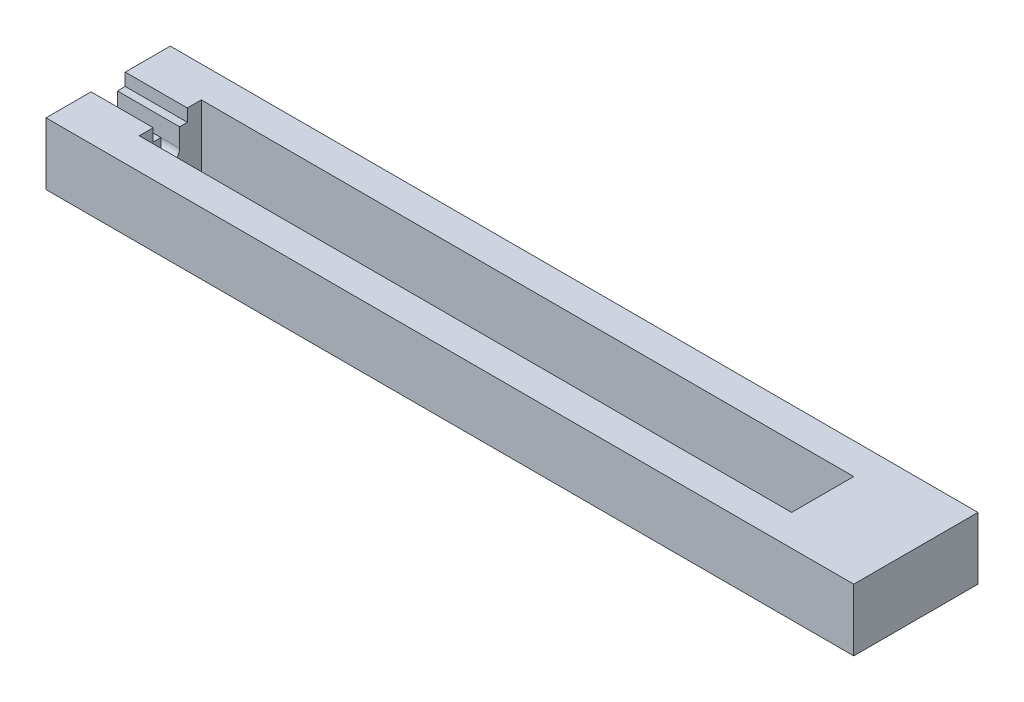
ISO-10303-21;
HEADER;
FILE_DESCRIPTION(('STEP AP214'),'2;1');
FILE_NAME('part.step','',(''),(''),'','','');
FILE_SCHEMA(('AUTOMOTIVE_DESIGN { 1 0 10303 214 1 1 1 1 }'));
ENDSEC;
DATA;
#1=APPLICATION_CONTEXT('core data for automotive mechanical design processes');
#2=APPLICATION_PROTOCOL_DEFINITION('international standard','automotive_design',2000,#1);
#3=PRODUCT_CONTEXT('',#1,'mechanical');
#4=PRODUCT('Part','Part','',(#3));
#5=PRODUCT_RELATED_PRODUCT_CATEGORY('part','',(#4));
#6=PRODUCT_DEFINITION_FORMATION('','',#4);
#7=PRODUCT_DEFINITION_CONTEXT('part definition',#1,'design');
#8=PRODUCT_DEFINITION('design','',#6,#7);
#9=PRODUCT_DEFINITION_SHAPE('','',#8);
#10=(LENGTH_UNIT() NAMED_UNIT(*) SI_UNIT(.MILLI.,.METRE.));
#11=(NAMED_UNIT(*) PLANE_ANGLE_UNIT() SI_UNIT($,.RADIAN.));
#12=(NAMED_UNIT(*) SI_UNIT($,.STERADIAN.) SOLID_ANGLE_UNIT());
#13=UNCERTAINTY_MEASURE_WITH_UNIT(LENGTH_MEASURE(1.E-05),#10,'distance_accuracy_value','');
#14=(GEOMETRIC_REPRESENTATION_CONTEXT(3) GLOBAL_UNCERTAINTY_ASSIGNED_CONTEXT((#13)) GLOBAL_UNIT_ASSIGNED_CONTEXT((#10,
#11,#12)) REPRESENTATION_CONTEXT('',''));
#15=CARTESIAN_POINT('',(0.,0.,0.));
#16=DIRECTION('',(0.,0.,1.));
#17=DIRECTION('',(1.,0.,0.));
#18=AXIS2_PLACEMENT_3D('',#15,#16,#17);
#19=CARTESIAN_POINT('',(0.,1.,0.));
#20=DIRECTION('',(0.,-1.,0.));
#21=DIRECTION('',(0.,0.,-1.));
#22=AXIS2_PLACEMENT_3D('',#19,#20,#21);
#23=PLANE('',#22);
#24=DIRECTION('',(-1.,0.,0.));
#25=VECTOR('',#24,1.);
#26=CARTESIAN_POINT('',(-5.5,1.,-0.275));
#27=LINE('',#26,#25);
#28=CARTESIAN_POINT('',(-5.5,1.,-0.275));
#29=VERTEX_POINT('',#28);
#30=CARTESIAN_POINT('',(-6.5,1.,-0.275));
#31=VERTEX_POINT('',#30);
#32=EDGE_CURVE('E201',#29,#31,#27,.T.);
#33=ORIENTED_EDGE('',*,*,#32,.F.);
#34=DIRECTION('',(0.,0.,1.));
#35=VECTOR('',#34,1.);
#36=CARTESIAN_POINT('',(-5.5,1.,-0.5));
#37=LINE('',#36,#35);
#38=CARTESIAN_POINT('',(-5.5,1.,-0.5));
#39=VERTEX_POINT('',#38);
#40=EDGE_CURVE('E216',#39,#29,#37,.T.);
#41=ORIENTED_EDGE('',*,*,#40,.F.);
#42=DIRECTION('',(-1.,0.,0.));
#43=VECTOR('',#42,1.);
#44=CARTESIAN_POINT('',(-5.5,1.,-0.5));
#45=LINE('',#44,#43);
#46=CARTESIAN_POINT('',(5.,0.999999999999998,-0.5));
#47=VERTEX_POINT('',#46);
#48=EDGE_CURVE('E213',#47,#39,#45,.T.);
#49=ORIENTED_EDGE('',*,*,#48,.F.);
#50=DIRECTION('',(0.,0.,-1.));
#51=VECTOR('',#50,1.);
#52=CARTESIAN_POINT('',(5.,0.999999999999998,-0.5));
#53=LINE('',#52,#51);
#54=CARTESIAN_POINT('',(5.,0.999999999999999,0.5));
#55=VERTEX_POINT('',#54);
#56=EDGE_CURVE('E211',#55,#47,#53,.T.);
#57=ORIENTED_EDGE('',*,*,#56,.F.);
#58=DIRECTION('',(1.,0.,0.));
#59=VECTOR('',#58,1.);
#60=CARTESIAN_POINT('',(-5.5,1.,0.5));
#61=LINE('',#60,#59);
#62=CARTESIAN_POINT('',(-5.5,1.,0.5));
#63=VERTEX_POINT('',#62);
#64=EDGE_CURVE('E218',#63,#55,#61,.T.);
#65=ORIENTED_EDGE('',*,*,#64,.F.);
#66=CARTESIAN_POINT('',(-5.5,1.,0.275));
#67=VERTEX_POINT('',#66);
#68=EDGE_CURVE('E55',#67,#63,#37,.T.);
#69=ORIENTED_EDGE('',*,*,#68,.F.);
#70=DIRECTION('',(-1.,0.,0.));
#71=VECTOR('',#70,1.);
#72=CARTESIAN_POINT('',(-5.5,1.,0.275));
#73=LINE('',#72,#71);
#74=CARTESIAN_POINT('',(-6.5,1.,0.275));
#75=VERTEX_POINT('',#74);
#76=EDGE_CURVE('E203',#67,#75,#73,.T.);
#77=ORIENTED_EDGE('',*,*,#76,.T.);
#78=DIRECTION('',(0.,0.,1.));
#79=VECTOR('',#78,1.);
#80=CARTESIAN_POINT('',(-6.5,1.,1.));
#81=LINE('',#80,#79);
#82=CARTESIAN_POINT('',(-6.5,1.,1.));
#83=VERTEX_POINT('',#82);
#84=EDGE_CURVE('E247',#75,#83,#81,.T.);
#85=ORIENTED_EDGE('',*,*,#84,.T.);
#86=DIRECTION('',(1.,0.,0.));
#87=VECTOR('',#86,1.);
#88=CARTESIAN_POINT('',(-6.5,1.,1.));
#89=LINE('',#88,#87);
#90=CARTESIAN_POINT('',(6.5,0.999999999999998,0.999999999999999));
#91=VERTEX_POINT('',#90);
#92=EDGE_CURVE('E251',#83,#91,#89,.T.);
#93=ORIENTED_EDGE('',*,*,#92,.T.);
#94=DIRECTION('',(0.,0.,-1.));
#95=VECTOR('',#94,1.);
#96=CARTESIAN_POINT('',(6.5,0.999999999999998,0.999999999999999));
#97=LINE('',#96,#95);
#98=CARTESIAN_POINT('',(6.5,0.999999999999998,-1.));
#99=VERTEX_POINT('',#98);
#100=EDGE_CURVE('E241',#91,#99,#97,.T.);
#101=ORIENTED_EDGE('',*,*,#100,.T.);
#102=DIRECTION('',(-1.,0.,0.));
#103=VECTOR('',#102,1.);
#104=CARTESIAN_POINT('',(-6.5,1.,-1.));
#105=LINE('',#104,#103);
#106=CARTESIAN_POINT('',(-6.5,1.,-1.));
#107=VERTEX_POINT('',#106);
#108=EDGE_CURVE('E244',#99,#107,#105,.T.);
#109=ORIENTED_EDGE('',*,*,#108,.T.);
#110=EDGE_CURVE('E248',#107,#31,#81,.T.);
#111=ORIENTED_EDGE('',*,*,#110,.T.);
#112=EDGE_LOOP('',(#33,#41,#49,#57,#65,#69,#77,#85,#93,#101,#109,#111));
#113=FACE_BOUND('',#112,.T.);
#114=ADVANCED_FACE('F32',(#113),#23,.F.);
#115=CARTESIAN_POINT('',(-6.5,1.,1.));
#116=DIRECTION('',(1.,0.,0.));
#117=DIRECTION('',(0.,0.,-1.));
#118=AXIS2_PLACEMENT_3D('',#115,#116,#117);
#119=PLANE('',#118);
#120=DIRECTION('',(0.,1.,0.));
#121=VECTOR('',#120,1.);
#122=CARTESIAN_POINT('',(-6.5,0.,-0.275));
#123=LINE('',#122,#121);
#124=CARTESIAN_POINT('',(-6.5,0.800000000000001,-0.275));
#125=VERTEX_POINT('',#124);
#126=EDGE_CURVE('E171',#125,#31,#123,.T.);
#127=ORIENTED_EDGE('',*,*,#126,.T.);
#128=ORIENTED_EDGE('',*,*,#110,.F.);
#129=DIRECTION('',(0.,-1.,0.));
#130=VECTOR('',#129,1.);
#131=CARTESIAN_POINT('',(-6.5,1.,-1.));
#132=LINE('',#131,#130);
#133=CARTESIAN_POINT('',(-6.5,0.,-1.));
#134=VERTEX_POINT('',#133);
#135=EDGE_CURVE('E40',#107,#134,#132,.T.);
#136=ORIENTED_EDGE('',*,*,#135,.T.);
#137=DIRECTION('',(0.,0.,1.));
#138=VECTOR('',#137,1.);
#139=CARTESIAN_POINT('',(-6.5,0.,1.));
#140=LINE('',#139,#138);
#141=CARTESIAN_POINT('',(-6.5,0.,1.));
#142=VERTEX_POINT('',#141);
#143=EDGE_CURVE('E258',#134,#142,#140,.T.);
#144=ORIENTED_EDGE('',*,*,#143,.T.);
#145=DIRECTION('',(0.,-1.,0.));
#146=VECTOR('',#145,1.);
#147=CARTESIAN_POINT('',(-6.5,1.,1.));
#148=LINE('',#147,#146);
#149=EDGE_CURVE('E263',#83,#142,#148,.T.);
#150=ORIENTED_EDGE('',*,*,#149,.F.);
#151=ORIENTED_EDGE('',*,*,#84,.F.);
#152=DIRECTION('',(0.,1.,0.));
#153=VECTOR('',#152,1.);
#154=CARTESIAN_POINT('',(-6.5,0.,0.275));
#155=LINE('',#154,#153);
#156=CARTESIAN_POINT('',(-6.5,0.800000000000001,0.275));
#157=VERTEX_POINT('',#156);
#158=EDGE_CURVE('E192',#157,#75,#155,.T.);
#159=ORIENTED_EDGE('',*,*,#158,.F.);
#160=DIRECTION('',(0.,0.,1.));
#161=VECTOR('',#160,1.);
#162=CARTESIAN_POINT('',(-6.5,0.800000000000001,0.));
#163=LINE('',#162,#161);
#164=CARTESIAN_POINT('',(-6.5,0.800000000000001,0.15));
#165=VERTEX_POINT('',#164);
#166=EDGE_CURVE('E189',#165,#157,#163,.T.);
#167=ORIENTED_EDGE('',*,*,#166,.F.);
#168=DIRECTION('',(0.,1.,0.));
#169=VECTOR('',#168,1.);
#170=CARTESIAN_POINT('',(-6.5,0.,0.15));
#171=LINE('',#170,#169);
#172=CARTESIAN_POINT('',(-6.5,0.500000000000001,0.15));
#173=VERTEX_POINT('',#172);
#174=EDGE_CURVE('E186',#173,#165,#171,.T.);
#175=ORIENTED_EDGE('',*,*,#174,.F.);
#176=CARTESIAN_POINT('',(-6.5,0.500000000000001,0.));
#177=DIRECTION('',(-1.,0.,0.));
#178=DIRECTION('',(0.,0.,1.));
#179=AXIS2_PLACEMENT_3D('',#176,#177,#178);
#180=CIRCLE('',#179,0.15);
#181=CARTESIAN_POINT('',(-6.5,0.500000000000002,-0.15));
#182=VERTEX_POINT('',#181);
#183=EDGE_CURVE('E184',#182,#173,#180,.T.);
#184=ORIENTED_EDGE('',*,*,#183,.F.);
#185=DIRECTION('',(0.,1.,0.));
#186=VECTOR('',#185,1.);
#187=CARTESIAN_POINT('',(-6.5,0.,-0.15));
#188=LINE('',#187,#186);
#189=CARTESIAN_POINT('',(-6.5,0.800000000000001,-0.15));
#190=VERTEX_POINT('',#189);
#191=EDGE_CURVE('E152',#182,#190,#188,.T.);
#192=ORIENTED_EDGE('',*,*,#191,.T.);
#193=DIRECTION('',(0.,0.,1.));
#194=VECTOR('',#193,1.);
#195=CARTESIAN_POINT('',(-6.5,0.800000000000001,0.));
#196=LINE('',#195,#194);
#197=EDGE_CURVE('E168',#125,#190,#196,.T.);
#198=ORIENTED_EDGE('',*,*,#197,.F.);
#199=EDGE_LOOP('',(#127,#128,#136,#144,#150,#151,#159,#167,#175,#184,#192,#198));
#200=FACE_BOUND('',#199,.T.);
#201=ADVANCED_FACE('F270',(#200),#119,.F.);
#202=CARTESIAN_POINT('',(-5.5,1.,-0.5));
#203=DIRECTION('',(1.,0.,0.));
#204=DIRECTION('',(0.,0.,-1.));
#205=AXIS2_PLACEMENT_3D('',#202,#203,#204);
#206=PLANE('',#205);
#207=ORIENTED_EDGE('',*,*,#40,.T.);
#208=DIRECTION('',(0.,1.,0.));
#209=VECTOR('',#208,1.);
#210=CARTESIAN_POINT('',(-5.5,0.,-0.275));
#211=LINE('',#210,#209);
#212=CARTESIAN_POINT('',(-5.5,0.800000000000001,-0.275));
#213=VERTEX_POINT('',#212);
#214=EDGE_CURVE('E180',#213,#29,#211,.T.);
#215=ORIENTED_EDGE('',*,*,#214,.F.);
#216=DIRECTION('',(0.,0.,1.));
#217=VECTOR('',#216,1.);
#218=CARTESIAN_POINT('',(-5.5,0.800000000000001,0.));
#219=LINE('',#218,#217);
#220=CARTESIAN_POINT('',(-5.5,0.800000000000001,-0.15));
#221=VERTEX_POINT('',#220);
#222=EDGE_CURVE('E157',#213,#221,#219,.T.);
#223=ORIENTED_EDGE('',*,*,#222,.T.);
#224=DIRECTION('',(0.,1.,0.));
#225=VECTOR('',#224,1.);
#226=CARTESIAN_POINT('',(-5.5,0.,-0.15));
#227=LINE('',#226,#225);
#228=CARTESIAN_POINT('',(-5.5,0.500000000000001,-0.15));
#229=VERTEX_POINT('',#228);
#230=EDGE_CURVE('E149',#229,#221,#227,.T.);
#231=ORIENTED_EDGE('',*,*,#230,.F.);
#232=CARTESIAN_POINT('',(-5.5,0.500000000000001,0.));
#233=DIRECTION('',(-1.,0.,0.));
#234=DIRECTION('',(0.,0.,1.));
#235=AXIS2_PLACEMENT_3D('',#232,#233,#234);
#236=CIRCLE('',#235,0.15);
#237=CARTESIAN_POINT('',(-5.5,0.500000000000001,0.15));
#238=VERTEX_POINT('',#237);
#239=EDGE_CURVE('E160',#229,#238,#236,.T.);
#240=ORIENTED_EDGE('',*,*,#239,.T.);
#241=DIRECTION('',(0.,1.,0.));
#242=VECTOR('',#241,1.);
#243=CARTESIAN_POINT('',(-5.5,0.,0.15));
#244=LINE('',#243,#242);
#245=CARTESIAN_POINT('',(-5.5,0.800000000000001,0.15));
#246=VERTEX_POINT('',#245);
#247=EDGE_CURVE('E47',#238,#246,#244,.T.);
#248=ORIENTED_EDGE('',*,*,#247,.T.);
#249=DIRECTION('',(0.,0.,1.));
#250=VECTOR('',#249,1.);
#251=CARTESIAN_POINT('',(-5.5,0.800000000000001,0.));
#252=LINE('',#251,#250);
#253=CARTESIAN_POINT('',(-5.5,0.800000000000001,0.275));
#254=VERTEX_POINT('',#253);
#255=EDGE_CURVE('E175',#246,#254,#252,.T.);
#256=ORIENTED_EDGE('',*,*,#255,.T.);
#257=DIRECTION('',(0.,1.,0.));
#258=VECTOR('',#257,1.);
#259=CARTESIAN_POINT('',(-5.5,0.,0.275));
#260=LINE('',#259,#258);
#261=EDGE_CURVE('E178',#254,#67,#260,.T.);
#262=ORIENTED_EDGE('',*,*,#261,.T.);
#263=ORIENTED_EDGE('',*,*,#68,.T.);
#264=DIRECTION('',(0.,-1.,0.));
#265=VECTOR('',#264,1.);
#266=CARTESIAN_POINT('',(-5.5,1.,0.5));
#267=LINE('',#266,#265);
#268=CARTESIAN_POINT('',(-5.5,0.,0.5));
#269=VERTEX_POINT('',#268);
#270=EDGE_CURVE('E233',#63,#269,#267,.T.);
#271=ORIENTED_EDGE('',*,*,#270,.T.);
#272=DIRECTION('',(0.,0.,1.));
#273=VECTOR('',#272,1.);
#274=CARTESIAN_POINT('',(-5.5,0.,-0.5));
#275=LINE('',#274,#273);
#276=CARTESIAN_POINT('',(-5.5,0.,-0.5));
#277=VERTEX_POINT('',#276);
#278=EDGE_CURVE('E226',#277,#269,#275,.T.);
#279=ORIENTED_EDGE('',*,*,#278,.F.);
#280=DIRECTION('',(0.,-1.,0.));
#281=VECTOR('',#280,1.);
#282=CARTESIAN_POINT('',(-5.5,1.,-0.5));
#283=LINE('',#282,#281);
#284=EDGE_CURVE('E235',#39,#277,#283,.T.);
#285=ORIENTED_EDGE('',*,*,#284,.F.);
#286=EDGE_LOOP('',(#207,#215,#223,#231,#240,#248,#256,#262,#263,#271,#279,#285));
#287=FACE_BOUND('',#286,.T.);
#288=ADVANCED_FACE('F165',(#287),#206,.T.);
#289=CARTESIAN_POINT('',(0.,0.,0.));
#290=DIRECTION('',(0.,-1.,0.));
#291=DIRECTION('',(0.,0.,-1.));
#292=AXIS2_PLACEMENT_3D('',#289,#290,#291);
#293=PLANE('',#292);
#294=DIRECTION('',(0.,0.,-1.));
#295=VECTOR('',#294,1.);
#296=CARTESIAN_POINT('',(6.5,0.,0.999999999999999));
#297=LINE('',#296,#295);
#298=CARTESIAN_POINT('',(6.5,0.,0.999999999999999));
#299=VERTEX_POINT('',#298);
#300=CARTESIAN_POINT('',(6.5,0.,-1.));
#301=VERTEX_POINT('',#300);
#302=EDGE_CURVE('E240',#299,#301,#297,.T.);
#303=ORIENTED_EDGE('',*,*,#302,.F.);
#304=DIRECTION('',(1.,0.,0.));
#305=VECTOR('',#304,1.);
#306=CARTESIAN_POINT('',(-6.5,0.,1.));
#307=LINE('',#306,#305);
#308=EDGE_CURVE('E245',#142,#299,#307,.T.);
#309=ORIENTED_EDGE('',*,*,#308,.F.);
#310=ORIENTED_EDGE('',*,*,#143,.F.);
#311=DIRECTION('',(-1.,0.,0.));
#312=VECTOR('',#311,1.);
#313=CARTESIAN_POINT('',(-6.5,0.,-1.));
#314=LINE('',#313,#312);
#315=EDGE_CURVE('E256',#301,#134,#314,.T.);
#316=ORIENTED_EDGE('',*,*,#315,.F.);
#317=EDGE_LOOP('',(#303,#309,#310,#316));
#318=FACE_BOUND('',#317,.T.);
#319=DIRECTION('',(1.,0.,0.));
#320=VECTOR('',#319,1.);
#321=CARTESIAN_POINT('',(-5.5,0.,0.5));
#322=LINE('',#321,#320);
#323=CARTESIAN_POINT('',(5.,0.,0.5));
#324=VERTEX_POINT('',#323);
#325=EDGE_CURVE('E214',#269,#324,#322,.T.);
#326=ORIENTED_EDGE('',*,*,#325,.T.);
#327=DIRECTION('',(0.,0.,-1.));
#328=VECTOR('',#327,1.);
#329=CARTESIAN_POINT('',(5.,0.,-0.5));
#330=LINE('',#329,#328);
#331=CARTESIAN_POINT('',(5.,0.,-0.5));
#332=VERTEX_POINT('',#331);
#333=EDGE_CURVE('E198',#324,#332,#330,.T.);
#334=ORIENTED_EDGE('',*,*,#333,.T.);
#335=DIRECTION('',(-1.,0.,0.));
#336=VECTOR('',#335,1.);
#337=CARTESIAN_POINT('',(-5.5,0.,-0.5));
#338=LINE('',#337,#336);
#339=EDGE_CURVE('E223',#332,#277,#338,.T.);
#340=ORIENTED_EDGE('',*,*,#339,.T.);
#341=ORIENTED_EDGE('',*,*,#278,.T.);
#342=EDGE_LOOP('',(#326,#334,#340,#341));
#343=FACE_BOUND('',#342,.T.);
#344=ADVANCED_FACE('F276',(#318,#343),#293,.T.);
#345=CARTESIAN_POINT('',(6.5,0.999999999999998,0.999999999999999));
#346=DIRECTION('',(-1.,0.,0.));
#347=DIRECTION('',(0.,0.,1.));
#348=AXIS2_PLACEMENT_3D('',#345,#346,#347);
#349=PLANE('',#348);
#350=ORIENTED_EDGE('',*,*,#302,.T.);
#351=DIRECTION('',(0.,-1.,0.));
#352=VECTOR('',#351,1.);
#353=CARTESIAN_POINT('',(6.5,0.999999999999998,-1.));
#354=LINE('',#353,#352);
#355=EDGE_CURVE('E11',#99,#301,#354,.T.);
#356=ORIENTED_EDGE('',*,*,#355,.F.);
#357=ORIENTED_EDGE('',*,*,#100,.F.);
#358=DIRECTION('',(0.,-1.,0.));
#359=VECTOR('',#358,1.);
#360=CARTESIAN_POINT('',(6.5,0.999999999999998,0.999999999999999));
#361=LINE('',#360,#359);
#362=EDGE_CURVE('E253',#91,#299,#361,.T.);
#363=ORIENTED_EDGE('',*,*,#362,.T.);
#364=EDGE_LOOP('',(#350,#356,#357,#363));
#365=FACE_BOUND('',#364,.T.);
#366=ADVANCED_FACE('F34',(#365),#349,.F.);
#367=CARTESIAN_POINT('',(-6.5,1.,-1.));
#368=DIRECTION('',(0.,0.,1.));
#369=DIRECTION('',(1.,0.,0.));
#370=AXIS2_PLACEMENT_3D('',#367,#368,#369);
#371=PLANE('',#370);
#372=ORIENTED_EDGE('',*,*,#315,.T.);
#373=ORIENTED_EDGE('',*,*,#135,.F.);
#374=ORIENTED_EDGE('',*,*,#108,.F.);
#375=ORIENTED_EDGE('',*,*,#355,.T.);
#376=EDGE_LOOP('',(#372,#373,#374,#375));
#377=FACE_BOUND('',#376,.T.);
#378=ADVANCED_FACE('F325',(#377),#371,.F.);
#379=CARTESIAN_POINT('',(-6.5,1.,1.));
#380=DIRECTION('',(0.,0.,-1.));
#381=DIRECTION('',(-1.,0.,0.));
#382=AXIS2_PLACEMENT_3D('',#379,#380,#381);
#383=PLANE('',#382);
#384=ORIENTED_EDGE('',*,*,#308,.T.);
#385=ORIENTED_EDGE('',*,*,#362,.F.);
#386=ORIENTED_EDGE('',*,*,#92,.F.);
#387=ORIENTED_EDGE('',*,*,#149,.T.);
#388=EDGE_LOOP('',(#384,#385,#386,#387));
#389=FACE_BOUND('',#388,.T.);
#390=ADVANCED_FACE('F280',(#389),#383,.F.);
#391=CARTESIAN_POINT('',(5.,0.999999999999998,-0.5));
#392=DIRECTION('',(-1.,0.,0.));
#393=DIRECTION('',(0.,0.,1.));
#394=AXIS2_PLACEMENT_3D('',#391,#392,#393);
#395=PLANE('',#394);
#396=ORIENTED_EDGE('',*,*,#333,.F.);
#397=DIRECTION('',(0.,-1.,0.));
#398=VECTOR('',#397,1.);
#399=CARTESIAN_POINT('',(5.,0.999999999999999,0.5));
#400=LINE('',#399,#398);
#401=EDGE_CURVE('E220',#55,#324,#400,.T.);
#402=ORIENTED_EDGE('',*,*,#401,.F.);
#403=ORIENTED_EDGE('',*,*,#56,.T.);
#404=DIRECTION('',(0.,-1.,0.));
#405=VECTOR('',#404,1.);
#406=CARTESIAN_POINT('',(5.,0.999999999999998,-0.5));
#407=LINE('',#406,#405);
#408=EDGE_CURVE('E237',#47,#332,#407,.T.);
#409=ORIENTED_EDGE('',*,*,#408,.T.);
#410=EDGE_LOOP('',(#396,#402,#403,#409));
#411=FACE_BOUND('',#410,.T.);
#412=ADVANCED_FACE('F315',(#411),#395,.T.);
#413=CARTESIAN_POINT('',(-5.5,1.,-0.5));
#414=DIRECTION('',(0.,0.,1.));
#415=DIRECTION('',(1.,0.,0.));
#416=AXIS2_PLACEMENT_3D('',#413,#414,#415);
#417=PLANE('',#416);
#418=ORIENTED_EDGE('',*,*,#339,.F.);
#419=ORIENTED_EDGE('',*,*,#408,.F.);
#420=ORIENTED_EDGE('',*,*,#48,.T.);
#421=ORIENTED_EDGE('',*,*,#284,.T.);
#422=EDGE_LOOP('',(#418,#419,#420,#421));
#423=FACE_BOUND('',#422,.T.);
#424=ADVANCED_FACE('F309',(#423),#417,.T.);
#425=CARTESIAN_POINT('',(-5.5,1.,0.5));
#426=DIRECTION('',(0.,0.,-1.));
#427=DIRECTION('',(-1.,0.,0.));
#428=AXIS2_PLACEMENT_3D('',#425,#426,#427);
#429=PLANE('',#428);
#430=ORIENTED_EDGE('',*,*,#325,.F.);
#431=ORIENTED_EDGE('',*,*,#270,.F.);
#432=ORIENTED_EDGE('',*,*,#64,.T.);
#433=ORIENTED_EDGE('',*,*,#401,.T.);
#434=EDGE_LOOP('',(#430,#431,#432,#433));
#435=FACE_BOUND('',#434,.T.);
#436=ADVANCED_FACE('F318',(#435),#429,.T.);
#437=CARTESIAN_POINT('',(-5.5,0.,-0.15));
#438=DIRECTION('',(0.,0.,1.));
#439=DIRECTION('',(1.,0.,0.));
#440=AXIS2_PLACEMENT_3D('',#437,#438,#439);
#441=PLANE('',#440);
#442=ORIENTED_EDGE('',*,*,#191,.F.);
#443=DIRECTION('',(-1.,0.,0.));
#444=VECTOR('',#443,1.);
#445=CARTESIAN_POINT('',(-5.5,0.500000000000001,-0.15));
#446=LINE('',#445,#444);
#447=EDGE_CURVE('E145',#229,#182,#446,.T.);
#448=ORIENTED_EDGE('',*,*,#447,.F.);
#449=ORIENTED_EDGE('',*,*,#230,.T.);
#450=DIRECTION('',(-1.,0.,0.));
#451=VECTOR('',#450,1.);
#452=CARTESIAN_POINT('',(-5.5,0.800000000000001,-0.15));
#453=LINE('',#452,#451);
#454=EDGE_CURVE('E196',#221,#190,#453,.T.);
#455=ORIENTED_EDGE('',*,*,#454,.T.);
#456=EDGE_LOOP('',(#442,#448,#449,#455));
#457=FACE_BOUND('',#456,.T.);
#458=ADVANCED_FACE('F147',(#457),#441,.T.);
#459=CARTESIAN_POINT('',(-5.5,0.800000000000001,0.));
#460=DIRECTION('',(0.,-1.,0.));
#461=DIRECTION('',(0.,0.,-1.));
#462=AXIS2_PLACEMENT_3D('',#459,#460,#461);
#463=PLANE('',#462);
#464=ORIENTED_EDGE('',*,*,#197,.T.);
#465=ORIENTED_EDGE('',*,*,#454,.F.);
#466=ORIENTED_EDGE('',*,*,#222,.F.);
#467=DIRECTION('',(-1.,0.,0.));
#468=VECTOR('',#467,1.);
#469=CARTESIAN_POINT('',(-5.5,0.800000000000001,-0.275));
#470=LINE('',#469,#468);
#471=EDGE_CURVE('E199',#213,#125,#470,.T.);
#472=ORIENTED_EDGE('',*,*,#471,.T.);
#473=EDGE_LOOP('',(#464,#465,#466,#472));
#474=FACE_BOUND('',#473,.T.);
#475=ADVANCED_FACE('F301',(#474),#463,.F.);
#476=CARTESIAN_POINT('',(-5.5,0.,-0.275));
#477=DIRECTION('',(0.,0.,1.));
#478=DIRECTION('',(1.,0.,0.));
#479=AXIS2_PLACEMENT_3D('',#476,#477,#478);
#480=PLANE('',#479);
#481=ORIENTED_EDGE('',*,*,#126,.F.);
#482=ORIENTED_EDGE('',*,*,#471,.F.);
#483=ORIENTED_EDGE('',*,*,#214,.T.);
#484=ORIENTED_EDGE('',*,*,#32,.T.);
#485=EDGE_LOOP('',(#481,#482,#483,#484));
#486=FACE_BOUND('',#485,.T.);
#487=ADVANCED_FACE('F303',(#486),#480,.T.);
#488=CARTESIAN_POINT('',(-5.5,0.,0.275));
#489=DIRECTION('',(0.,0.,1.));
#490=DIRECTION('',(1.,0.,0.));
#491=AXIS2_PLACEMENT_3D('',#488,#489,#490);
#492=PLANE('',#491);
#493=ORIENTED_EDGE('',*,*,#158,.T.);
#494=ORIENTED_EDGE('',*,*,#76,.F.);
#495=ORIENTED_EDGE('',*,*,#261,.F.);
#496=DIRECTION('',(-1.,0.,0.));
#497=VECTOR('',#496,1.);
#498=CARTESIAN_POINT('',(-5.5,0.800000000000001,0.275));
#499=LINE('',#498,#497);
#500=EDGE_CURVE('E206',#254,#157,#499,.T.);
#501=ORIENTED_EDGE('',*,*,#500,.T.);
#502=EDGE_LOOP('',(#493,#494,#495,#501));
#503=FACE_BOUND('',#502,.T.);
#504=ADVANCED_FACE('F292',(#503),#492,.F.);
#505=CARTESIAN_POINT('',(-5.5,0.800000000000001,0.));
#506=DIRECTION('',(0.,-1.,0.));
#507=DIRECTION('',(0.,0.,-1.));
#508=AXIS2_PLACEMENT_3D('',#505,#506,#507);
#509=PLANE('',#508);
#510=ORIENTED_EDGE('',*,*,#166,.T.);
#511=ORIENTED_EDGE('',*,*,#500,.F.);
#512=ORIENTED_EDGE('',*,*,#255,.F.);
#513=DIRECTION('',(-1.,0.,0.));
#514=VECTOR('',#513,1.);
#515=CARTESIAN_POINT('',(-5.5,0.800000000000001,0.15));
#516=LINE('',#515,#514);
#517=EDGE_CURVE('E208',#246,#165,#516,.T.);
#518=ORIENTED_EDGE('',*,*,#517,.T.);
#519=EDGE_LOOP('',(#510,#511,#512,#518));
#520=FACE_BOUND('',#519,.T.);
#521=ADVANCED_FACE('F296',(#520),#509,.F.);
#522=CARTESIAN_POINT('',(-5.5,0.,0.15));
#523=DIRECTION('',(0.,0.,1.));
#524=DIRECTION('',(0.,-1.,0.));
#525=AXIS2_PLACEMENT_3D('',#522,#523,#524);
#526=PLANE('',#525);
#527=ORIENTED_EDGE('',*,*,#174,.T.);
#528=ORIENTED_EDGE('',*,*,#517,.F.);
#529=ORIENTED_EDGE('',*,*,#247,.F.);
#530=DIRECTION('',(-1.,0.,0.));
#531=VECTOR('',#530,1.);
#532=CARTESIAN_POINT('',(-5.5,0.500000000000001,0.15));
#533=LINE('',#532,#531);
#534=EDGE_CURVE('E156',#238,#173,#533,.T.);
#535=ORIENTED_EDGE('',*,*,#534,.T.);
#536=EDGE_LOOP('',(#527,#528,#529,#535));
#537=FACE_BOUND('',#536,.T.);
#538=ADVANCED_FACE('F297',(#537),#526,.F.);
#539=CARTESIAN_POINT('',(-5.5,0.500000000000001,0.));
#540=DIRECTION('',(-1.,0.,0.));
#541=DIRECTION('',(0.,0.,1.));
#542=AXIS2_PLACEMENT_3D('',#539,#540,#541);
#543=CYLINDRICAL_SURFACE('',#542,0.15);
#544=ORIENTED_EDGE('',*,*,#183,.T.);
#545=ORIENTED_EDGE('',*,*,#534,.F.);
#546=ORIENTED_EDGE('',*,*,#239,.F.);
#547=ORIENTED_EDGE('',*,*,#447,.T.);
#548=EDGE_LOOP('',(#544,#545,#546,#547));
#549=FACE_BOUND('',#548,.T.);
#550=ADVANCED_FACE('F161',(#549),#543,.F.);
#551=CLOSED_SHELL('',(#114,#201,#288,#344,#366,#378,#390,#412,#424,#436,#458,#475,#487,#504,
#521,#538,#550));
#552=MANIFOLD_SOLID_BREP('B2',#551);
#553=ADVANCED_BREP_SHAPE_REPRESENTATION('',(#18,#552),#14);
#554=SHAPE_DEFINITION_REPRESENTATION(#9,#553);
ENDSEC;
END-ISO-10303-21;
